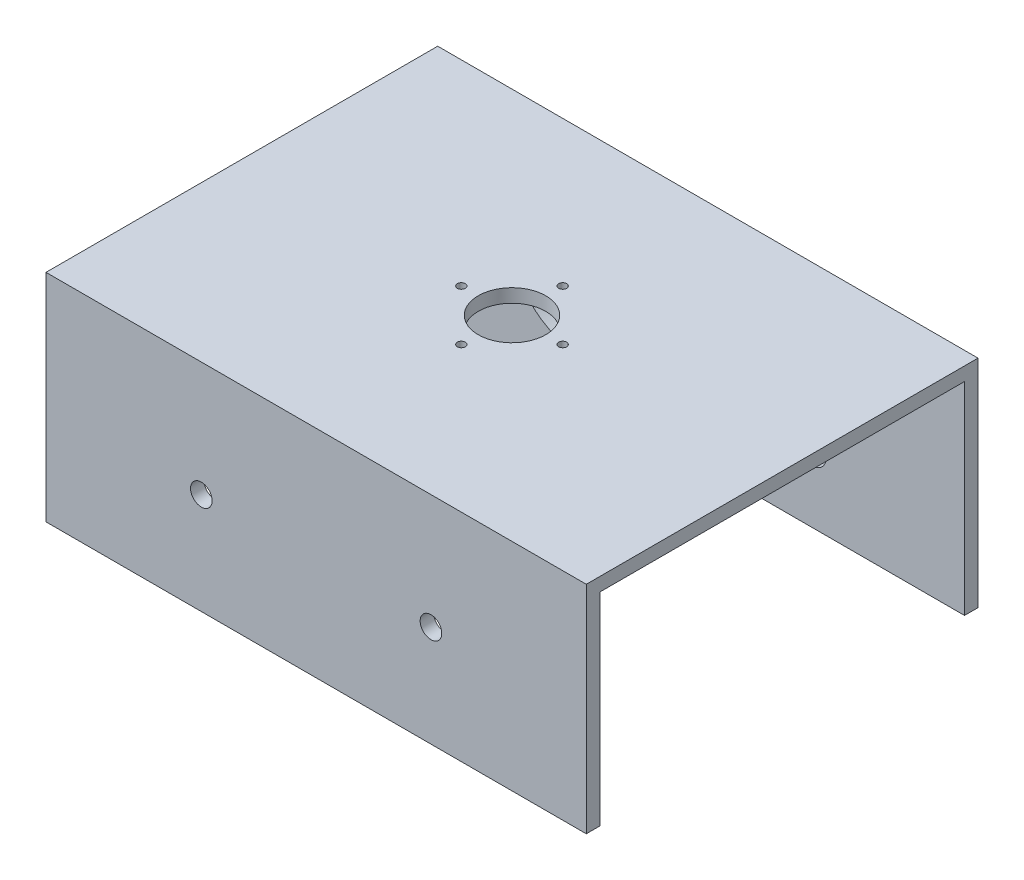
ISO-10303-21;
HEADER;
FILE_DESCRIPTION(('STEP AP214'),'2;1');
FILE_NAME('part.step','',(''),(''),'','','');
FILE_SCHEMA(('AUTOMOTIVE_DESIGN { 1 0 10303 214 1 1 1 1 }'));
ENDSEC;
DATA;
#1=APPLICATION_CONTEXT('core data for automotive mechanical design processes');
#2=APPLICATION_PROTOCOL_DEFINITION('international standard','automotive_design',2000,#1);
#3=PRODUCT_CONTEXT('',#1,'mechanical');
#4=PRODUCT('Part','Part','',(#3));
#5=PRODUCT_RELATED_PRODUCT_CATEGORY('part','',(#4));
#6=PRODUCT_DEFINITION_FORMATION('','',#4);
#7=PRODUCT_DEFINITION_CONTEXT('part definition',#1,'design');
#8=PRODUCT_DEFINITION('design','',#6,#7);
#9=PRODUCT_DEFINITION_SHAPE('','',#8);
#10=(LENGTH_UNIT() NAMED_UNIT(*) SI_UNIT(.MILLI.,.METRE.));
#11=(NAMED_UNIT(*) PLANE_ANGLE_UNIT() SI_UNIT($,.RADIAN.));
#12=(NAMED_UNIT(*) SI_UNIT($,.STERADIAN.) SOLID_ANGLE_UNIT());
#13=UNCERTAINTY_MEASURE_WITH_UNIT(LENGTH_MEASURE(1.E-05),#10,'distance_accuracy_value','');
#14=(GEOMETRIC_REPRESENTATION_CONTEXT(3) GLOBAL_UNCERTAINTY_ASSIGNED_CONTEXT((#13)) GLOBAL_UNIT_ASSIGNED_CONTEXT((#10,
#11,#12)) REPRESENTATION_CONTEXT('',''));
#15=CARTESIAN_POINT('',(0.,0.,0.));
#16=DIRECTION('',(0.,0.,1.));
#17=DIRECTION('',(1.,0.,0.));
#18=AXIS2_PLACEMENT_3D('',#15,#16,#17);
#19=CARTESIAN_POINT('',(0.,15.,0.));
#20=DIRECTION('',(0.,-1.,0.));
#21=DIRECTION('',(0.,0.,-1.));
#22=AXIS2_PLACEMENT_3D('',#19,#20,#21);
#23=PLANE('',#22);
#24=CARTESIAN_POINT('',(-7.5,15.,-27.));
#25=DIRECTION('',(0.,-1.,0.));
#26=DIRECTION('',(0.,0.,-1.));
#27=AXIS2_PLACEMENT_3D('',#24,#25,#26);
#28=CIRCLE('',#27,0.6);
#29=CARTESIAN_POINT('',(-7.5,15.,-27.6));
#30=VERTEX_POINT('',#29);
#31=EDGE_CURVE('E194',#30,#30,#28,.F.);
#32=ORIENTED_EDGE('',*,*,#31,.T.);
#33=EDGE_LOOP('',(#32));
#34=FACE_BOUND('',#33,.T.);
#35=CARTESIAN_POINT('',(7.50000000000001,15.,-27.));
#36=DIRECTION('',(0.,-1.,0.));
#37=DIRECTION('',(0.,0.,-1.));
#38=AXIS2_PLACEMENT_3D('',#35,#36,#37);
#39=CIRCLE('',#38,0.6);
#40=CARTESIAN_POINT('',(7.50000000000001,15.,-27.6));
#41=VERTEX_POINT('',#40);
#42=EDGE_CURVE('E200',#41,#41,#39,.F.);
#43=ORIENTED_EDGE('',*,*,#42,.T.);
#44=EDGE_LOOP('',(#43));
#45=FACE_BOUND('',#44,.T.);
#46=CARTESIAN_POINT('',(0.,15.,-34.5));
#47=DIRECTION('',(0.,-1.,0.));
#48=DIRECTION('',(0.,0.,-1.));
#49=AXIS2_PLACEMENT_3D('',#46,#47,#48);
#50=CIRCLE('',#49,0.600000000000002);
#51=CARTESIAN_POINT('',(0.,15.,-35.1));
#52=VERTEX_POINT('',#51);
#53=EDGE_CURVE('E201',#52,#52,#50,.F.);
#54=ORIENTED_EDGE('',*,*,#53,.T.);
#55=EDGE_LOOP('',(#54));
#56=FACE_BOUND('',#55,.T.);
#57=CARTESIAN_POINT('',(0.,15.,-19.5));
#58=DIRECTION('',(0.,-1.,0.));
#59=DIRECTION('',(0.,0.,-1.));
#60=AXIS2_PLACEMENT_3D('',#57,#58,#59);
#61=CIRCLE('',#60,0.6);
#62=CARTESIAN_POINT('',(0.,15.,-20.1));
#63=VERTEX_POINT('',#62);
#64=EDGE_CURVE('E212',#63,#63,#61,.F.);
#65=ORIENTED_EDGE('',*,*,#64,.T.);
#66=EDGE_LOOP('',(#65));
#67=FACE_BOUND('',#66,.T.);
#68=CARTESIAN_POINT('',(0.,15.,-27.));
#69=DIRECTION('',(0.,-1.,0.));
#70=DIRECTION('',(0.,0.,-1.));
#71=AXIS2_PLACEMENT_3D('',#68,#69,#70);
#72=CIRCLE('',#71,5.);
#73=CARTESIAN_POINT('',(0.,15.,-32.));
#74=VERTEX_POINT('',#73);
#75=EDGE_CURVE('E191',#74,#74,#72,.F.);
#76=ORIENTED_EDGE('',*,*,#75,.T.);
#77=EDGE_LOOP('',(#76));
#78=FACE_BOUND('',#77,.T.);
#79=DIRECTION('',(0.,0.,1.));
#80=VECTOR('',#79,1.);
#81=CARTESIAN_POINT('',(-40.,15.,2.));
#82=LINE('',#81,#80);
#83=CARTESIAN_POINT('',(-40.,15.,-54.));
#84=VERTEX_POINT('',#83);
#85=CARTESIAN_POINT('',(-40.,15.,0.));
#86=VERTEX_POINT('',#85);
#87=EDGE_CURVE('E116',#84,#86,#82,.T.);
#88=ORIENTED_EDGE('',*,*,#87,.F.);
#89=DIRECTION('',(-1.,0.,0.));
#90=VECTOR('',#89,1.);
#91=CARTESIAN_POINT('',(40.,15.,-54.));
#92=LINE('',#91,#90);
#93=CARTESIAN_POINT('',(40.,15.,-54.));
#94=VERTEX_POINT('',#93);
#95=EDGE_CURVE('E121',#94,#84,#92,.T.);
#96=ORIENTED_EDGE('',*,*,#95,.F.);
#97=DIRECTION('',(0.,0.,-1.));
#98=VECTOR('',#97,1.);
#99=CARTESIAN_POINT('',(40.,15.,-56.));
#100=LINE('',#99,#98);
#101=CARTESIAN_POINT('',(40.,15.,0.));
#102=VERTEX_POINT('',#101);
#103=EDGE_CURVE('E120',#102,#94,#100,.T.);
#104=ORIENTED_EDGE('',*,*,#103,.F.);
#105=DIRECTION('',(-1.,0.,0.));
#106=VECTOR('',#105,1.);
#107=CARTESIAN_POINT('',(-40.,15.,0.));
#108=LINE('',#107,#106);
#109=EDGE_CURVE('E100',#102,#86,#108,.T.);
#110=ORIENTED_EDGE('',*,*,#109,.T.);
#111=EDGE_LOOP('',(#88,#96,#104,#110));
#112=FACE_BOUND('',#111,.T.);
#113=ADVANCED_FACE('F40',(#34,#45,#56,#67,#78,#112),#23,.T.);
#114=CARTESIAN_POINT('',(40.,-15.,2.));
#115=DIRECTION('',(-1.,0.,0.));
#116=DIRECTION('',(0.,0.,1.));
#117=AXIS2_PLACEMENT_3D('',#114,#115,#116);
#118=PLANE('',#117);
#119=DIRECTION('',(0.,1.,0.));
#120=VECTOR('',#119,1.);
#121=CARTESIAN_POINT('',(40.,-15.,0.));
#122=LINE('',#121,#120);
#123=CARTESIAN_POINT('',(40.,-15.,0.));
#124=VERTEX_POINT('',#123);
#125=EDGE_CURVE('E94',#124,#102,#122,.T.);
#126=ORIENTED_EDGE('',*,*,#125,.T.);
#127=ORIENTED_EDGE('',*,*,#103,.T.);
#128=DIRECTION('',(0.,1.,0.));
#129=VECTOR('',#128,1.);
#130=CARTESIAN_POINT('',(40.,-15.,-54.));
#131=LINE('',#130,#129);
#132=CARTESIAN_POINT('',(40.,-15.,-54.));
#133=VERTEX_POINT('',#132);
#134=EDGE_CURVE('E56',#133,#94,#131,.T.);
#135=ORIENTED_EDGE('',*,*,#134,.F.);
#136=DIRECTION('',(0.,0.,1.));
#137=VECTOR('',#136,1.);
#138=CARTESIAN_POINT('',(40.,-15.,-56.));
#139=LINE('',#138,#137);
#140=CARTESIAN_POINT('',(40.,-15.,-56.));
#141=VERTEX_POINT('',#140);
#142=EDGE_CURVE('E157',#141,#133,#139,.T.);
#143=ORIENTED_EDGE('',*,*,#142,.F.);
#144=DIRECTION('',(0.,-1.,0.));
#145=VECTOR('',#144,1.);
#146=CARTESIAN_POINT('',(40.,17.,-56.));
#147=LINE('',#146,#145);
#148=CARTESIAN_POINT('',(40.,17.,-56.));
#149=VERTEX_POINT('',#148);
#150=EDGE_CURVE('E105',#149,#141,#147,.T.);
#151=ORIENTED_EDGE('',*,*,#150,.F.);
#152=DIRECTION('',(0.,0.,-1.));
#153=VECTOR('',#152,1.);
#154=CARTESIAN_POINT('',(40.,17.,-56.));
#155=LINE('',#154,#153);
#156=CARTESIAN_POINT('',(40.,17.,2.));
#157=VERTEX_POINT('',#156);
#158=EDGE_CURVE('E131',#157,#149,#155,.T.);
#159=ORIENTED_EDGE('',*,*,#158,.F.);
#160=DIRECTION('',(0.,1.,0.));
#161=VECTOR('',#160,1.);
#162=CARTESIAN_POINT('',(40.,-15.,2.));
#163=LINE('',#162,#161);
#164=CARTESIAN_POINT('',(40.,-15.,2.));
#165=VERTEX_POINT('',#164);
#166=EDGE_CURVE('E88',#165,#157,#163,.T.);
#167=ORIENTED_EDGE('',*,*,#166,.F.);
#168=DIRECTION('',(0.,0.,-1.));
#169=VECTOR('',#168,1.);
#170=CARTESIAN_POINT('',(40.,-15.,2.));
#171=LINE('',#170,#169);
#172=EDGE_CURVE('E49',#165,#124,#171,.T.);
#173=ORIENTED_EDGE('',*,*,#172,.T.);
#174=EDGE_LOOP('',(#126,#127,#135,#143,#151,#159,#167,#173));
#175=FACE_BOUND('',#174,.T.);
#176=ADVANCED_FACE('F42',(#175),#118,.F.);
#177=CARTESIAN_POINT('',(-40.,-15.,2.));
#178=DIRECTION('',(1.,0.,0.));
#179=DIRECTION('',(0.,0.,-1.));
#180=AXIS2_PLACEMENT_3D('',#177,#178,#179);
#181=PLANE('',#180);
#182=DIRECTION('',(0.,-1.,0.));
#183=VECTOR('',#182,1.);
#184=CARTESIAN_POINT('',(-40.,-15.,0.));
#185=LINE('',#184,#183);
#186=CARTESIAN_POINT('',(-40.,-15.,0.));
#187=VERTEX_POINT('',#186);
#188=EDGE_CURVE('E89',#86,#187,#185,.T.);
#189=ORIENTED_EDGE('',*,*,#188,.T.);
#190=DIRECTION('',(0.,0.,-1.));
#191=VECTOR('',#190,1.);
#192=CARTESIAN_POINT('',(-40.,-15.,2.));
#193=LINE('',#192,#191);
#194=CARTESIAN_POINT('',(-40.,-15.,2.));
#195=VERTEX_POINT('',#194);
#196=EDGE_CURVE('E11',#195,#187,#193,.T.);
#197=ORIENTED_EDGE('',*,*,#196,.F.);
#198=DIRECTION('',(0.,-1.,0.));
#199=VECTOR('',#198,1.);
#200=CARTESIAN_POINT('',(-40.,-15.,2.));
#201=LINE('',#200,#199);
#202=CARTESIAN_POINT('',(-40.,17.,2.));
#203=VERTEX_POINT('',#202);
#204=EDGE_CURVE('E133',#203,#195,#201,.T.);
#205=ORIENTED_EDGE('',*,*,#204,.F.);
#206=DIRECTION('',(0.,0.,1.));
#207=VECTOR('',#206,1.);
#208=CARTESIAN_POINT('',(-40.,17.,2.));
#209=LINE('',#208,#207);
#210=CARTESIAN_POINT('',(-40.,17.,-56.));
#211=VERTEX_POINT('',#210);
#212=EDGE_CURVE('E125',#211,#203,#209,.T.);
#213=ORIENTED_EDGE('',*,*,#212,.F.);
#214=DIRECTION('',(0.,-1.,0.));
#215=VECTOR('',#214,1.);
#216=CARTESIAN_POINT('',(-40.,17.,-56.));
#217=LINE('',#216,#215);
#218=CARTESIAN_POINT('',(-40.,-15.,-56.));
#219=VERTEX_POINT('',#218);
#220=EDGE_CURVE('E101',#211,#219,#217,.T.);
#221=ORIENTED_EDGE('',*,*,#220,.T.);
#222=DIRECTION('',(0.,0.,-1.));
#223=VECTOR('',#222,1.);
#224=CARTESIAN_POINT('',(-40.,-15.,-54.));
#225=LINE('',#224,#223);
#226=CARTESIAN_POINT('',(-40.,-15.,-54.));
#227=VERTEX_POINT('',#226);
#228=EDGE_CURVE('E168',#227,#219,#225,.T.);
#229=ORIENTED_EDGE('',*,*,#228,.F.);
#230=DIRECTION('',(0.,1.,0.));
#231=VECTOR('',#230,1.);
#232=CARTESIAN_POINT('',(-40.,-15.,-54.));
#233=LINE('',#232,#231);
#234=EDGE_CURVE('E181',#227,#84,#233,.T.);
#235=ORIENTED_EDGE('',*,*,#234,.T.);
#236=ORIENTED_EDGE('',*,*,#87,.T.);
#237=EDGE_LOOP('',(#189,#197,#205,#213,#221,#229,#235,#236));
#238=FACE_BOUND('',#237,.T.);
#239=ADVANCED_FACE('F112',(#238),#181,.F.);
#240=CARTESIAN_POINT('',(-40.,-15.,2.));
#241=DIRECTION('',(0.,1.,0.));
#242=DIRECTION('',(0.,0.,1.));
#243=AXIS2_PLACEMENT_3D('',#240,#241,#242);
#244=PLANE('',#243);
#245=DIRECTION('',(1.,0.,0.));
#246=VECTOR('',#245,1.);
#247=CARTESIAN_POINT('',(-40.,-15.,0.));
#248=LINE('',#247,#246);
#249=EDGE_CURVE('E80',#187,#124,#248,.T.);
#250=ORIENTED_EDGE('',*,*,#249,.T.);
#251=ORIENTED_EDGE('',*,*,#172,.F.);
#252=DIRECTION('',(1.,0.,0.));
#253=VECTOR('',#252,1.);
#254=CARTESIAN_POINT('',(-40.,-15.,2.));
#255=LINE('',#254,#253);
#256=EDGE_CURVE('E65',#195,#165,#255,.T.);
#257=ORIENTED_EDGE('',*,*,#256,.F.);
#258=ORIENTED_EDGE('',*,*,#196,.T.);
#259=EDGE_LOOP('',(#250,#251,#257,#258));
#260=FACE_BOUND('',#259,.T.);
#261=ADVANCED_FACE('F82',(#260),#244,.F.);
#262=CARTESIAN_POINT('',(0.,0.,2.));
#263=DIRECTION('',(0.,0.,-1.));
#264=DIRECTION('',(-1.,0.,0.));
#265=AXIS2_PLACEMENT_3D('',#262,#263,#264);
#266=PLANE('',#265);
#267=CARTESIAN_POINT('',(17.,0.,2.));
#268=DIRECTION('',(0.,0.,-1.));
#269=DIRECTION('',(-1.,0.,0.));
#270=AXIS2_PLACEMENT_3D('',#267,#268,#269);
#271=CIRCLE('',#270,1.6);
#272=CARTESIAN_POINT('',(15.4,0.,2.));
#273=VERTEX_POINT('',#272);
#274=EDGE_CURVE('E226',#273,#273,#271,.F.);
#275=ORIENTED_EDGE('',*,*,#274,.F.);
#276=EDGE_LOOP('',(#275));
#277=FACE_BOUND('',#276,.T.);
#278=CARTESIAN_POINT('',(-17.,0.,2.));
#279=DIRECTION('',(0.,0.,-1.));
#280=DIRECTION('',(-1.,0.,0.));
#281=AXIS2_PLACEMENT_3D('',#278,#279,#280);
#282=CIRCLE('',#281,1.6);
#283=CARTESIAN_POINT('',(-18.6,0.,2.));
#284=VERTEX_POINT('',#283);
#285=EDGE_CURVE('E227',#284,#284,#282,.F.);
#286=ORIENTED_EDGE('',*,*,#285,.F.);
#287=EDGE_LOOP('',(#286));
#288=FACE_BOUND('',#287,.T.);
#289=ORIENTED_EDGE('',*,*,#166,.T.);
#290=DIRECTION('',(1.,0.,0.));
#291=VECTOR('',#290,1.);
#292=CARTESIAN_POINT('',(-40.,17.,2.));
#293=LINE('',#292,#291);
#294=EDGE_CURVE('E138',#203,#157,#293,.T.);
#295=ORIENTED_EDGE('',*,*,#294,.F.);
#296=ORIENTED_EDGE('',*,*,#204,.T.);
#297=ORIENTED_EDGE('',*,*,#256,.T.);
#298=EDGE_LOOP('',(#289,#295,#296,#297));
#299=FACE_BOUND('',#298,.T.);
#300=ADVANCED_FACE('F135',(#277,#288,#299),#266,.F.);
#301=CARTESIAN_POINT('',(0.,0.,0.));
#302=DIRECTION('',(0.,0.,-1.));
#303=DIRECTION('',(-1.,0.,0.));
#304=AXIS2_PLACEMENT_3D('',#301,#302,#303);
#305=PLANE('',#304);
#306=CARTESIAN_POINT('',(17.,0.,0.));
#307=DIRECTION('',(0.,0.,-1.));
#308=DIRECTION('',(-1.,0.,0.));
#309=AXIS2_PLACEMENT_3D('',#306,#307,#308);
#310=CIRCLE('',#309,1.6);
#311=CARTESIAN_POINT('',(15.4,0.,0.));
#312=VERTEX_POINT('',#311);
#313=EDGE_CURVE('E213',#312,#312,#310,.T.);
#314=ORIENTED_EDGE('',*,*,#313,.F.);
#315=EDGE_LOOP('',(#314));
#316=FACE_BOUND('',#315,.T.);
#317=CARTESIAN_POINT('',(-17.,0.,0.));
#318=DIRECTION('',(0.,0.,-1.));
#319=DIRECTION('',(-1.,0.,0.));
#320=AXIS2_PLACEMENT_3D('',#317,#318,#319);
#321=CIRCLE('',#320,1.6);
#322=CARTESIAN_POINT('',(-18.6,0.,0.));
#323=VERTEX_POINT('',#322);
#324=EDGE_CURVE('E223',#323,#323,#321,.T.);
#325=ORIENTED_EDGE('',*,*,#324,.F.);
#326=EDGE_LOOP('',(#325));
#327=FACE_BOUND('',#326,.T.);
#328=ORIENTED_EDGE('',*,*,#125,.F.);
#329=ORIENTED_EDGE('',*,*,#249,.F.);
#330=ORIENTED_EDGE('',*,*,#188,.F.);
#331=ORIENTED_EDGE('',*,*,#109,.F.);
#332=EDGE_LOOP('',(#328,#329,#330,#331));
#333=FACE_BOUND('',#332,.T.);
#334=ADVANCED_FACE('F98',(#316,#327,#333),#305,.T.);
#335=CARTESIAN_POINT('',(-40.,17.,-56.));
#336=DIRECTION('',(0.,0.,1.));
#337=DIRECTION('',(1.,0.,0.));
#338=AXIS2_PLACEMENT_3D('',#335,#336,#337);
#339=PLANE('',#338);
#340=CARTESIAN_POINT('',(-32.07,5.,-56.));
#341=DIRECTION('',(0.,0.,1.));
#342=DIRECTION('',(1.,0.,0.));
#343=AXIS2_PLACEMENT_3D('',#340,#341,#342);
#344=CIRCLE('',#343,2.1);
#345=CARTESIAN_POINT('',(-29.97,5.,-56.));
#346=VERTEX_POINT('',#345);
#347=EDGE_CURVE('E249',#346,#346,#344,.F.);
#348=ORIENTED_EDGE('',*,*,#347,.F.);
#349=EDGE_LOOP('',(#348));
#350=FACE_BOUND('',#349,.T.);
#351=CARTESIAN_POINT('',(-32.07,-5.,-56.));
#352=DIRECTION('',(0.,0.,1.));
#353=DIRECTION('',(1.,0.,0.));
#354=AXIS2_PLACEMENT_3D('',#351,#352,#353);
#355=CIRCLE('',#354,2.1);
#356=CARTESIAN_POINT('',(-29.97,-5.,-56.));
#357=VERTEX_POINT('',#356);
#358=EDGE_CURVE('E258',#357,#357,#355,.F.);
#359=ORIENTED_EDGE('',*,*,#358,.F.);
#360=EDGE_LOOP('',(#359));
#361=FACE_BOUND('',#360,.T.);
#362=CARTESIAN_POINT('',(17.42,5.,-56.));
#363=DIRECTION('',(0.,0.,1.));
#364=DIRECTION('',(1.,0.,0.));
#365=AXIS2_PLACEMENT_3D('',#362,#363,#364);
#366=CIRCLE('',#365,2.1);
#367=CARTESIAN_POINT('',(19.52,5.,-56.));
#368=VERTEX_POINT('',#367);
#369=EDGE_CURVE('E241',#368,#368,#366,.F.);
#370=ORIENTED_EDGE('',*,*,#369,.F.);
#371=EDGE_LOOP('',(#370));
#372=FACE_BOUND('',#371,.T.);
#373=CARTESIAN_POINT('',(17.42,-5.,-56.));
#374=DIRECTION('',(0.,0.,1.));
#375=DIRECTION('',(1.,0.,0.));
#376=AXIS2_PLACEMENT_3D('',#373,#374,#375);
#377=CIRCLE('',#376,2.1);
#378=CARTESIAN_POINT('',(19.52,-5.,-56.));
#379=VERTEX_POINT('',#378);
#380=EDGE_CURVE('E246',#379,#379,#377,.F.);
#381=ORIENTED_EDGE('',*,*,#380,.F.);
#382=EDGE_LOOP('',(#381));
#383=FACE_BOUND('',#382,.T.);
#384=CARTESIAN_POINT('',(-17.,0.,-56.));
#385=DIRECTION('',(0.,0.,-1.));
#386=DIRECTION('',(-1.,0.,0.));
#387=AXIS2_PLACEMENT_3D('',#384,#385,#386);
#388=CIRCLE('',#387,10.1);
#389=CARTESIAN_POINT('',(-27.1,0.,-56.));
#390=VERTEX_POINT('',#389);
#391=EDGE_CURVE('E238',#390,#390,#388,.T.);
#392=ORIENTED_EDGE('',*,*,#391,.F.);
#393=EDGE_LOOP('',(#392));
#394=FACE_BOUND('',#393,.T.);
#395=CARTESIAN_POINT('',(17.,0.,-56.));
#396=DIRECTION('',(0.,0.,-1.));
#397=DIRECTION('',(-1.,0.,0.));
#398=AXIS2_PLACEMENT_3D('',#395,#396,#397);
#399=CIRCLE('',#398,1.6);
#400=CARTESIAN_POINT('',(15.4,0.,-56.));
#401=VERTEX_POINT('',#400);
#402=EDGE_CURVE('E230',#401,#401,#399,.T.);
#403=ORIENTED_EDGE('',*,*,#402,.F.);
#404=EDGE_LOOP('',(#403));
#405=FACE_BOUND('',#404,.T.);
#406=ORIENTED_EDGE('',*,*,#150,.T.);
#407=DIRECTION('',(1.,0.,0.));
#408=VECTOR('',#407,1.);
#409=CARTESIAN_POINT('',(-40.,-15.,-56.));
#410=LINE('',#409,#408);
#411=EDGE_CURVE('E163',#219,#141,#410,.T.);
#412=ORIENTED_EDGE('',*,*,#411,.F.);
#413=ORIENTED_EDGE('',*,*,#220,.F.);
#414=DIRECTION('',(-1.,0.,0.));
#415=VECTOR('',#414,1.);
#416=CARTESIAN_POINT('',(-40.,17.,-56.));
#417=LINE('',#416,#415);
#418=EDGE_CURVE('E122',#149,#211,#417,.T.);
#419=ORIENTED_EDGE('',*,*,#418,.F.);
#420=EDGE_LOOP('',(#406,#412,#413,#419));
#421=FACE_BOUND('',#420,.T.);
#422=ADVANCED_FACE('F161',(#350,#361,#372,#383,#394,#405,#421),#339,.F.);
#423=CARTESIAN_POINT('',(0.,17.,0.));
#424=DIRECTION('',(0.,-1.,0.));
#425=DIRECTION('',(0.,0.,-1.));
#426=AXIS2_PLACEMENT_3D('',#423,#424,#425);
#427=PLANE('',#426);
#428=CARTESIAN_POINT('',(-7.5,17.,-27.));
#429=DIRECTION('',(0.,1.,0.));
#430=DIRECTION('',(0.,0.,1.));
#431=AXIS2_PLACEMENT_3D('',#428,#429,#430);
#432=CIRCLE('',#431,0.6);
#433=CARTESIAN_POINT('',(-7.5,17.,-26.4));
#434=VERTEX_POINT('',#433);
#435=EDGE_CURVE('E204',#434,#434,#432,.T.);
#436=ORIENTED_EDGE('',*,*,#435,.F.);
#437=EDGE_LOOP('',(#436));
#438=FACE_BOUND('',#437,.T.);
#439=CARTESIAN_POINT('',(7.50000000000001,17.,-27.));
#440=DIRECTION('',(0.,1.,0.));
#441=DIRECTION('',(0.,0.,1.));
#442=AXIS2_PLACEMENT_3D('',#439,#440,#441);
#443=CIRCLE('',#442,0.6);
#444=CARTESIAN_POINT('',(7.50000000000001,17.,-26.4));
#445=VERTEX_POINT('',#444);
#446=EDGE_CURVE('E197',#445,#445,#443,.T.);
#447=ORIENTED_EDGE('',*,*,#446,.F.);
#448=EDGE_LOOP('',(#447));
#449=FACE_BOUND('',#448,.T.);
#450=CARTESIAN_POINT('',(0.,17.,-34.5));
#451=DIRECTION('',(0.,1.,0.));
#452=DIRECTION('',(0.,0.,1.));
#453=AXIS2_PLACEMENT_3D('',#450,#451,#452);
#454=CIRCLE('',#453,0.600000000000002);
#455=CARTESIAN_POINT('',(0.,17.,-33.9));
#456=VERTEX_POINT('',#455);
#457=EDGE_CURVE('E216',#456,#456,#454,.T.);
#458=ORIENTED_EDGE('',*,*,#457,.F.);
#459=EDGE_LOOP('',(#458));
#460=FACE_BOUND('',#459,.T.);
#461=CARTESIAN_POINT('',(0.,17.,-19.5));
#462=DIRECTION('',(0.,1.,0.));
#463=DIRECTION('',(0.,0.,1.));
#464=AXIS2_PLACEMENT_3D('',#461,#462,#463);
#465=CIRCLE('',#464,0.6);
#466=CARTESIAN_POINT('',(0.,17.,-18.9));
#467=VERTEX_POINT('',#466);
#468=EDGE_CURVE('E209',#467,#467,#465,.T.);
#469=ORIENTED_EDGE('',*,*,#468,.F.);
#470=EDGE_LOOP('',(#469));
#471=FACE_BOUND('',#470,.T.);
#472=CARTESIAN_POINT('',(0.,17.,-27.));
#473=DIRECTION('',(0.,1.,0.));
#474=DIRECTION('',(0.,0.,1.));
#475=AXIS2_PLACEMENT_3D('',#472,#473,#474);
#476=CIRCLE('',#475,5.);
#477=CARTESIAN_POINT('',(0.,17.,-22.));
#478=VERTEX_POINT('',#477);
#479=EDGE_CURVE('E186',#478,#478,#476,.T.);
#480=ORIENTED_EDGE('',*,*,#479,.F.);
#481=EDGE_LOOP('',(#480));
#482=FACE_BOUND('',#481,.T.);
#483=ORIENTED_EDGE('',*,*,#418,.T.);
#484=ORIENTED_EDGE('',*,*,#212,.T.);
#485=ORIENTED_EDGE('',*,*,#294,.T.);
#486=ORIENTED_EDGE('',*,*,#158,.T.);
#487=EDGE_LOOP('',(#483,#484,#485,#486));
#488=FACE_BOUND('',#487,.T.);
#489=ADVANCED_FACE('F145',(#438,#449,#460,#471,#482,#488),#427,.F.);
#490=CARTESIAN_POINT('',(40.,-15.,-54.));
#491=DIRECTION('',(0.,0.,-1.));
#492=DIRECTION('',(-1.,0.,0.));
#493=AXIS2_PLACEMENT_3D('',#490,#491,#492);
#494=PLANE('',#493);
#495=CARTESIAN_POINT('',(-32.07,5.,-54.));
#496=DIRECTION('',(0.,0.,1.));
#497=DIRECTION('',(1.,0.,0.));
#498=AXIS2_PLACEMENT_3D('',#495,#496,#497);
#499=CIRCLE('',#498,2.1);
#500=CARTESIAN_POINT('',(-29.97,5.,-54.));
#501=VERTEX_POINT('',#500);
#502=EDGE_CURVE('E257',#501,#501,#499,.T.);
#503=ORIENTED_EDGE('',*,*,#502,.F.);
#504=EDGE_LOOP('',(#503));
#505=FACE_BOUND('',#504,.T.);
#506=CARTESIAN_POINT('',(-32.07,-5.,-54.));
#507=DIRECTION('',(0.,0.,1.));
#508=DIRECTION('',(1.,0.,0.));
#509=AXIS2_PLACEMENT_3D('',#506,#507,#508);
#510=CIRCLE('',#509,2.1);
#511=CARTESIAN_POINT('',(-29.97,-5.,-54.));
#512=VERTEX_POINT('',#511);
#513=EDGE_CURVE('E254',#512,#512,#510,.T.);
#514=ORIENTED_EDGE('',*,*,#513,.F.);
#515=EDGE_LOOP('',(#514));
#516=FACE_BOUND('',#515,.T.);
#517=CARTESIAN_POINT('',(17.42,5.,-54.));
#518=DIRECTION('',(0.,0.,1.));
#519=DIRECTION('',(1.,0.,0.));
#520=AXIS2_PLACEMENT_3D('',#517,#518,#519);
#521=CIRCLE('',#520,2.1);
#522=CARTESIAN_POINT('',(19.52,5.,-54.));
#523=VERTEX_POINT('',#522);
#524=EDGE_CURVE('E245',#523,#523,#521,.T.);
#525=ORIENTED_EDGE('',*,*,#524,.F.);
#526=EDGE_LOOP('',(#525));
#527=FACE_BOUND('',#526,.T.);
#528=CARTESIAN_POINT('',(17.42,-5.,-54.));
#529=DIRECTION('',(0.,0.,1.));
#530=DIRECTION('',(1.,0.,0.));
#531=AXIS2_PLACEMENT_3D('',#528,#529,#530);
#532=CIRCLE('',#531,2.1);
#533=CARTESIAN_POINT('',(19.52,-5.,-54.));
#534=VERTEX_POINT('',#533);
#535=EDGE_CURVE('E242',#534,#534,#532,.T.);
#536=ORIENTED_EDGE('',*,*,#535,.F.);
#537=EDGE_LOOP('',(#536));
#538=FACE_BOUND('',#537,.T.);
#539=CARTESIAN_POINT('',(-17.,0.,-54.));
#540=DIRECTION('',(0.,0.,-1.));
#541=DIRECTION('',(-1.,0.,0.));
#542=AXIS2_PLACEMENT_3D('',#539,#540,#541);
#543=CIRCLE('',#542,10.1);
#544=CARTESIAN_POINT('',(-27.1,0.,-54.));
#545=VERTEX_POINT('',#544);
#546=EDGE_CURVE('E231',#545,#545,#543,.F.);
#547=ORIENTED_EDGE('',*,*,#546,.F.);
#548=EDGE_LOOP('',(#547));
#549=FACE_BOUND('',#548,.T.);
#550=CARTESIAN_POINT('',(17.,0.,-54.));
#551=DIRECTION('',(0.,0.,-1.));
#552=DIRECTION('',(-1.,0.,0.));
#553=AXIS2_PLACEMENT_3D('',#550,#551,#552);
#554=CIRCLE('',#553,1.6);
#555=CARTESIAN_POINT('',(15.4,0.,-54.));
#556=VERTEX_POINT('',#555);
#557=EDGE_CURVE('E44',#556,#556,#554,.T.);
#558=ORIENTED_EDGE('',*,*,#557,.T.);
#559=EDGE_LOOP('',(#558));
#560=FACE_BOUND('',#559,.T.);
#561=ORIENTED_EDGE('',*,*,#95,.T.);
#562=ORIENTED_EDGE('',*,*,#234,.F.);
#563=DIRECTION('',(-1.,0.,0.));
#564=VECTOR('',#563,1.);
#565=CARTESIAN_POINT('',(40.,-15.,-54.));
#566=LINE('',#565,#564);
#567=EDGE_CURVE('E178',#133,#227,#566,.T.);
#568=ORIENTED_EDGE('',*,*,#567,.F.);
#569=ORIENTED_EDGE('',*,*,#134,.T.);
#570=EDGE_LOOP('',(#561,#562,#568,#569));
#571=FACE_BOUND('',#570,.T.);
#572=ADVANCED_FACE('F183',(#505,#516,#527,#538,#549,#560,#571),#494,.F.);
#573=CARTESIAN_POINT('',(0.,-15.,0.));
#574=DIRECTION('',(0.,-1.,0.));
#575=DIRECTION('',(0.,0.,-1.));
#576=AXIS2_PLACEMENT_3D('',#573,#574,#575);
#577=PLANE('',#576);
#578=ORIENTED_EDGE('',*,*,#228,.T.);
#579=ORIENTED_EDGE('',*,*,#411,.T.);
#580=ORIENTED_EDGE('',*,*,#142,.T.);
#581=ORIENTED_EDGE('',*,*,#567,.T.);
#582=EDGE_LOOP('',(#578,#579,#580,#581));
#583=FACE_BOUND('',#582,.T.);
#584=ADVANCED_FACE('F180',(#583),#577,.T.);
#585=CARTESIAN_POINT('',(0.,-15.001,-27.));
#586=DIRECTION('',(0.,1.,0.));
#587=DIRECTION('',(0.,0.,1.));
#588=AXIS2_PLACEMENT_3D('',#585,#586,#587);
#589=CYLINDRICAL_SURFACE('',#588,5.);
#590=ORIENTED_EDGE('',*,*,#75,.F.);
#591=EDGE_LOOP('',(#590));
#592=FACE_BOUND('',#591,.T.);
#593=ORIENTED_EDGE('',*,*,#479,.T.);
#594=EDGE_LOOP('',(#593));
#595=FACE_BOUND('',#594,.T.);
#596=ADVANCED_FACE('F363',(#592,#595),#589,.F.);
#597=CARTESIAN_POINT('',(0.,-15.001,-19.5));
#598=DIRECTION('',(0.,1.,0.));
#599=DIRECTION('',(0.,0.,1.));
#600=AXIS2_PLACEMENT_3D('',#597,#598,#599);
#601=CYLINDRICAL_SURFACE('',#600,0.6);
#602=ORIENTED_EDGE('',*,*,#64,.F.);
#603=EDGE_LOOP('',(#602));
#604=FACE_BOUND('',#603,.T.);
#605=ORIENTED_EDGE('',*,*,#468,.T.);
#606=EDGE_LOOP('',(#605));
#607=FACE_BOUND('',#606,.T.);
#608=ADVANCED_FACE('F369',(#604,#607),#601,.F.);
#609=CARTESIAN_POINT('',(0.,-15.001,-34.5));
#610=DIRECTION('',(0.,1.,0.));
#611=DIRECTION('',(0.,0.,1.));
#612=AXIS2_PLACEMENT_3D('',#609,#610,#611);
#613=CYLINDRICAL_SURFACE('',#612,0.600000000000002);
#614=ORIENTED_EDGE('',*,*,#53,.F.);
#615=EDGE_LOOP('',(#614));
#616=FACE_BOUND('',#615,.T.);
#617=ORIENTED_EDGE('',*,*,#457,.T.);
#618=EDGE_LOOP('',(#617));
#619=FACE_BOUND('',#618,.T.);
#620=ADVANCED_FACE('F377',(#616,#619),#613,.F.);
#621=CARTESIAN_POINT('',(7.50000000000001,-15.001,-27.));
#622=DIRECTION('',(0.,1.,0.));
#623=DIRECTION('',(0.,0.,1.));
#624=AXIS2_PLACEMENT_3D('',#621,#622,#623);
#625=CYLINDRICAL_SURFACE('',#624,0.6);
#626=ORIENTED_EDGE('',*,*,#42,.F.);
#627=EDGE_LOOP('',(#626));
#628=FACE_BOUND('',#627,.T.);
#629=ORIENTED_EDGE('',*,*,#446,.T.);
#630=EDGE_LOOP('',(#629));
#631=FACE_BOUND('',#630,.T.);
#632=ADVANCED_FACE('F296',(#628,#631),#625,.F.);
#633=CARTESIAN_POINT('',(-7.5,-15.001,-27.));
#634=DIRECTION('',(0.,1.,0.));
#635=DIRECTION('',(0.,0.,1.));
#636=AXIS2_PLACEMENT_3D('',#633,#634,#635);
#637=CYLINDRICAL_SURFACE('',#636,0.6);
#638=ORIENTED_EDGE('',*,*,#31,.F.);
#639=EDGE_LOOP('',(#638));
#640=FACE_BOUND('',#639,.T.);
#641=ORIENTED_EDGE('',*,*,#435,.T.);
#642=EDGE_LOOP('',(#641));
#643=FACE_BOUND('',#642,.T.);
#644=ADVANCED_FACE('F286',(#640,#643),#637,.F.);
#645=CARTESIAN_POINT('',(17.,0.,6.52548339959391));
#646=DIRECTION('',(0.,0.,-1.));
#647=DIRECTION('',(-1.,0.,0.));
#648=AXIS2_PLACEMENT_3D('',#645,#646,#647);
#649=CYLINDRICAL_SURFACE('',#648,1.6);
#650=ORIENTED_EDGE('',*,*,#402,.T.);
#651=EDGE_LOOP('',(#650));
#652=FACE_BOUND('',#651,.T.);
#653=ORIENTED_EDGE('',*,*,#557,.F.);
#654=EDGE_LOOP('',(#653));
#655=FACE_BOUND('',#654,.T.);
#656=ADVANCED_FACE('F283',(#652,#655),#649,.F.);
#657=CARTESIAN_POINT('',(-17.,0.,6.52548339959391));
#658=DIRECTION('',(0.,0.,-1.));
#659=DIRECTION('',(-1.,0.,0.));
#660=AXIS2_PLACEMENT_3D('',#657,#658,#659);
#661=CYLINDRICAL_SURFACE('',#660,1.6);
#662=ORIENTED_EDGE('',*,*,#324,.T.);
#663=EDGE_LOOP('',(#662));
#664=FACE_BOUND('',#663,.T.);
#665=ORIENTED_EDGE('',*,*,#285,.T.);
#666=EDGE_LOOP('',(#665));
#667=FACE_BOUND('',#666,.T.);
#668=ADVANCED_FACE('F285',(#664,#667),#661,.F.);
#669=ORIENTED_EDGE('',*,*,#313,.T.);
#670=EDGE_LOOP('',(#669));
#671=FACE_BOUND('',#670,.T.);
#672=ORIENTED_EDGE('',*,*,#274,.T.);
#673=EDGE_LOOP('',(#672));
#674=FACE_BOUND('',#673,.T.);
#675=ADVANCED_FACE('F289',(#671,#674),#649,.F.);
#676=CARTESIAN_POINT('',(-17.,0.,2.001));
#677=DIRECTION('',(0.,0.,-1.));
#678=DIRECTION('',(-1.,0.,0.));
#679=AXIS2_PLACEMENT_3D('',#676,#677,#678);
#680=CYLINDRICAL_SURFACE('',#679,10.1);
#681=ORIENTED_EDGE('',*,*,#391,.T.);
#682=EDGE_LOOP('',(#681));
#683=FACE_BOUND('',#682,.T.);
#684=ORIENTED_EDGE('',*,*,#546,.T.);
#685=EDGE_LOOP('',(#684));
#686=FACE_BOUND('',#685,.T.);
#687=ADVANCED_FACE('F301',(#683,#686),#680,.F.);
#688=CARTESIAN_POINT('',(17.42,-5.,-56.001));
#689=DIRECTION('',(0.,0.,1.));
#690=DIRECTION('',(1.,0.,0.));
#691=AXIS2_PLACEMENT_3D('',#688,#689,#690);
#692=CYLINDRICAL_SURFACE('',#691,2.1);
#693=ORIENTED_EDGE('',*,*,#535,.T.);
#694=EDGE_LOOP('',(#693));
#695=FACE_BOUND('',#694,.T.);
#696=ORIENTED_EDGE('',*,*,#380,.T.);
#697=EDGE_LOOP('',(#696));
#698=FACE_BOUND('',#697,.T.);
#699=ADVANCED_FACE('F432',(#695,#698),#692,.F.);
#700=CARTESIAN_POINT('',(17.42,5.,-56.001));
#701=DIRECTION('',(0.,0.,1.));
#702=DIRECTION('',(1.,0.,0.));
#703=AXIS2_PLACEMENT_3D('',#700,#701,#702);
#704=CYLINDRICAL_SURFACE('',#703,2.1);
#705=ORIENTED_EDGE('',*,*,#524,.T.);
#706=EDGE_LOOP('',(#705));
#707=FACE_BOUND('',#706,.T.);
#708=ORIENTED_EDGE('',*,*,#369,.T.);
#709=EDGE_LOOP('',(#708));
#710=FACE_BOUND('',#709,.T.);
#711=ADVANCED_FACE('F442',(#707,#710),#704,.F.);
#712=CARTESIAN_POINT('',(-32.07,-5.,-56.001));
#713=DIRECTION('',(0.,0.,1.));
#714=DIRECTION('',(1.,0.,0.));
#715=AXIS2_PLACEMENT_3D('',#712,#713,#714);
#716=CYLINDRICAL_SURFACE('',#715,2.1);
#717=ORIENTED_EDGE('',*,*,#513,.T.);
#718=EDGE_LOOP('',(#717));
#719=FACE_BOUND('',#718,.T.);
#720=ORIENTED_EDGE('',*,*,#358,.T.);
#721=EDGE_LOOP('',(#720));
#722=FACE_BOUND('',#721,.T.);
#723=ADVANCED_FACE('F452',(#719,#722),#716,.F.);
#724=CARTESIAN_POINT('',(-32.07,5.,-56.001));
#725=DIRECTION('',(0.,0.,1.));
#726=DIRECTION('',(1.,0.,0.));
#727=AXIS2_PLACEMENT_3D('',#724,#725,#726);
#728=CYLINDRICAL_SURFACE('',#727,2.1);
#729=ORIENTED_EDGE('',*,*,#502,.T.);
#730=EDGE_LOOP('',(#729));
#731=FACE_BOUND('',#730,.T.);
#732=ORIENTED_EDGE('',*,*,#347,.T.);
#733=EDGE_LOOP('',(#732));
#734=FACE_BOUND('',#733,.T.);
#735=ADVANCED_FACE('F266',(#731,#734),#728,.F.);
#736=CLOSED_SHELL('',(#113,#176,#239,#261,#300,#334,#422,#489,#572,#584,#596,#608,#620,#632,
#644,#656,#668,#675,#687,#699,#711,#723,#735));
#737=MANIFOLD_SOLID_BREP('B2',#736);
#738=ADVANCED_BREP_SHAPE_REPRESENTATION('',(#18,#737),#14);
#739=SHAPE_DEFINITION_REPRESENTATION(#9,#738);
ENDSEC;
END-ISO-10303-21;
